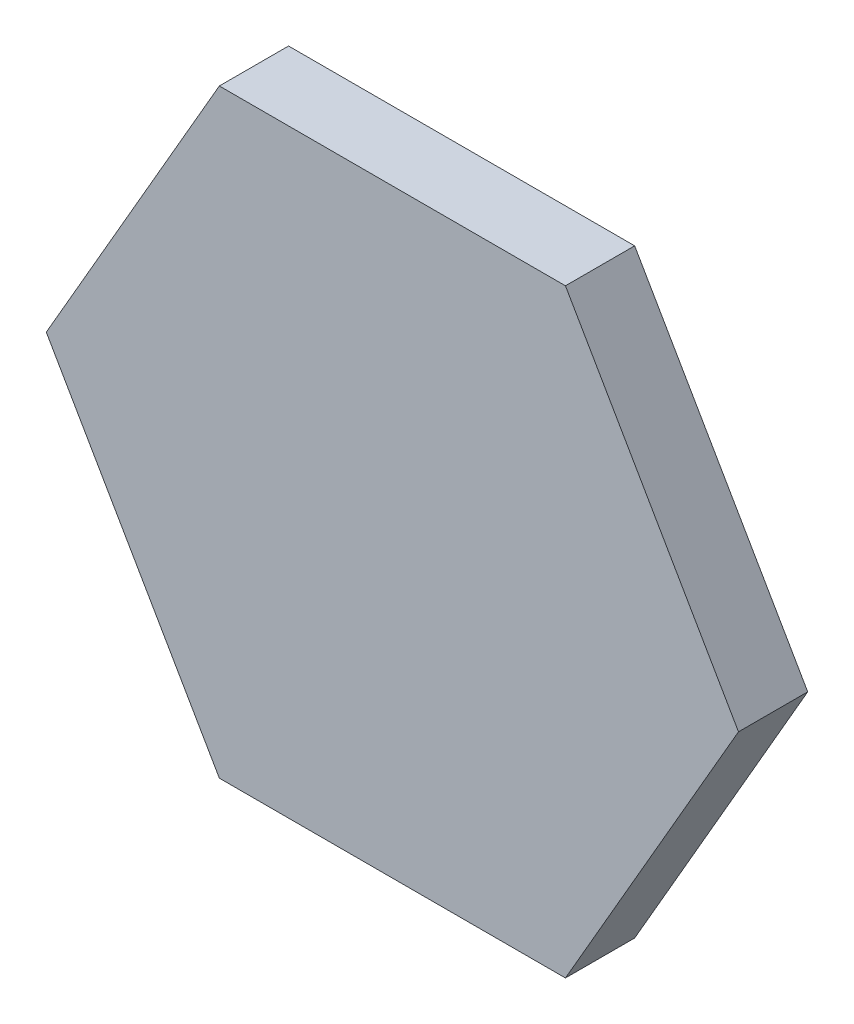
ISO-10303-21;
HEADER;
FILE_DESCRIPTION(('STEP AP214'),'2;1');
FILE_NAME('part.step','',(''),(''),'','','');
FILE_SCHEMA(('AUTOMOTIVE_DESIGN { 1 0 10303 214 1 1 1 1 }'));
ENDSEC;
DATA;
#1=APPLICATION_CONTEXT('core data for automotive mechanical design processes');
#2=APPLICATION_PROTOCOL_DEFINITION('international standard','automotive_design',2000,#1);
#3=PRODUCT_CONTEXT('',#1,'mechanical');
#4=PRODUCT('Part','Part','',(#3));
#5=PRODUCT_RELATED_PRODUCT_CATEGORY('part','',(#4));
#6=PRODUCT_DEFINITION_FORMATION('','',#4);
#7=PRODUCT_DEFINITION_CONTEXT('part definition',#1,'design');
#8=PRODUCT_DEFINITION('design','',#6,#7);
#9=PRODUCT_DEFINITION_SHAPE('','',#8);
#10=(LENGTH_UNIT() NAMED_UNIT(*) SI_UNIT(.MILLI.,.METRE.));
#11=(NAMED_UNIT(*) PLANE_ANGLE_UNIT() SI_UNIT($,.RADIAN.));
#12=(NAMED_UNIT(*) SI_UNIT($,.STERADIAN.) SOLID_ANGLE_UNIT());
#13=UNCERTAINTY_MEASURE_WITH_UNIT(LENGTH_MEASURE(1.E-05),#10,'distance_accuracy_value','');
#14=(GEOMETRIC_REPRESENTATION_CONTEXT(3) GLOBAL_UNCERTAINTY_ASSIGNED_CONTEXT((#13)) GLOBAL_UNIT_ASSIGNED_CONTEXT((#10,
#11,#12)) REPRESENTATION_CONTEXT('',''));
#15=CARTESIAN_POINT('',(0.,0.,0.));
#16=DIRECTION('',(0.,0.,1.));
#17=DIRECTION('',(1.,0.,0.));
#18=AXIS2_PLACEMENT_3D('',#15,#16,#17);
#19=CARTESIAN_POINT('',(-37.5,-64.9519052838329,15.));
#20=DIRECTION('',(0.,1.,0.));
#21=DIRECTION('',(0.,0.,1.));
#22=AXIS2_PLACEMENT_3D('',#19,#20,#21);
#23=PLANE('',#22);
#24=DIRECTION('',(1.,0.,0.));
#25=VECTOR('',#24,1.);
#26=CARTESIAN_POINT('',(-37.5,-64.9519052838329,0.));
#27=LINE('',#26,#25);
#28=CARTESIAN_POINT('',(-37.5,-64.9519052838329,0.));
#29=VERTEX_POINT('',#28);
#30=CARTESIAN_POINT('',(37.5,-64.9519052838329,0.));
#31=VERTEX_POINT('',#30);
#32=EDGE_CURVE('E116',#29,#31,#27,.T.);
#33=ORIENTED_EDGE('',*,*,#32,.T.);
#34=DIRECTION('',(0.,0.,-1.));
#35=VECTOR('',#34,1.);
#36=CARTESIAN_POINT('',(37.5,-64.9519052838329,15.));
#37=LINE('',#36,#35);
#38=CARTESIAN_POINT('',(37.5,-64.9519052838329,15.));
#39=VERTEX_POINT('',#38);
#40=EDGE_CURVE('E11',#39,#31,#37,.T.);
#41=ORIENTED_EDGE('',*,*,#40,.F.);
#42=DIRECTION('',(1.,0.,0.));
#43=VECTOR('',#42,1.);
#44=CARTESIAN_POINT('',(-37.5,-64.9519052838329,15.));
#45=LINE('',#44,#43);
#46=CARTESIAN_POINT('',(-37.5,-64.9519052838329,15.));
#47=VERTEX_POINT('',#46);
#48=EDGE_CURVE('E126',#47,#39,#45,.T.);
#49=ORIENTED_EDGE('',*,*,#48,.F.);
#50=DIRECTION('',(0.,0.,-1.));
#51=VECTOR('',#50,1.);
#52=CARTESIAN_POINT('',(-37.5,-64.9519052838329,15.));
#53=LINE('',#52,#51);
#54=EDGE_CURVE('E112',#47,#29,#53,.T.);
#55=ORIENTED_EDGE('',*,*,#54,.T.);
#56=EDGE_LOOP('',(#33,#41,#49,#55));
#57=FACE_BOUND('',#56,.T.);
#58=ADVANCED_FACE('F32',(#57),#23,.F.);
#59=CARTESIAN_POINT('',(37.5,-64.9519052838329,15.));
#60=DIRECTION('',(-0.866025403784439,0.5,0.));
#61=DIRECTION('',(-0.5,-0.866025403784439,0.));
#62=AXIS2_PLACEMENT_3D('',#59,#60,#61);
#63=PLANE('',#62);
#64=DIRECTION('',(0.5,0.866025403784439,0.));
#65=VECTOR('',#64,1.);
#66=CARTESIAN_POINT('',(37.5,-64.9519052838329,0.));
#67=LINE('',#66,#65);
#68=CARTESIAN_POINT('',(75.,0.,0.));
#69=VERTEX_POINT('',#68);
#70=EDGE_CURVE('E119',#31,#69,#67,.T.);
#71=ORIENTED_EDGE('',*,*,#70,.T.);
#72=DIRECTION('',(0.,0.,-1.));
#73=VECTOR('',#72,1.);
#74=CARTESIAN_POINT('',(75.,0.,15.));
#75=LINE('',#74,#73);
#76=CARTESIAN_POINT('',(75.,0.,15.));
#77=VERTEX_POINT('',#76);
#78=EDGE_CURVE('E40',#77,#69,#75,.T.);
#79=ORIENTED_EDGE('',*,*,#78,.F.);
#80=DIRECTION('',(0.5,0.866025403784439,0.));
#81=VECTOR('',#80,1.);
#82=CARTESIAN_POINT('',(37.5,-64.9519052838329,15.));
#83=LINE('',#82,#81);
#84=EDGE_CURVE('E85',#39,#77,#83,.T.);
#85=ORIENTED_EDGE('',*,*,#84,.F.);
#86=ORIENTED_EDGE('',*,*,#40,.T.);
#87=EDGE_LOOP('',(#71,#79,#85,#86));
#88=FACE_BOUND('',#87,.T.);
#89=ADVANCED_FACE('F150',(#88),#63,.F.);
#90=CARTESIAN_POINT('',(75.,0.,15.));
#91=DIRECTION('',(-0.866025403784439,-0.5,0.));
#92=DIRECTION('',(0.5,-0.866025403784439,0.));
#93=AXIS2_PLACEMENT_3D('',#90,#91,#92);
#94=PLANE('',#93);
#95=DIRECTION('',(-0.5,0.866025403784439,0.));
#96=VECTOR('',#95,1.);
#97=CARTESIAN_POINT('',(75.,0.,0.));
#98=LINE('',#97,#96);
#99=CARTESIAN_POINT('',(37.5,64.9519052838329,0.));
#100=VERTEX_POINT('',#99);
#101=EDGE_CURVE('E121',#69,#100,#98,.T.);
#102=ORIENTED_EDGE('',*,*,#101,.T.);
#103=DIRECTION('',(0.,0.,-1.));
#104=VECTOR('',#103,1.);
#105=CARTESIAN_POINT('',(37.5,64.9519052838329,15.));
#106=LINE('',#105,#104);
#107=CARTESIAN_POINT('',(37.5,64.9519052838329,15.));
#108=VERTEX_POINT('',#107);
#109=EDGE_CURVE('E107',#108,#100,#106,.T.);
#110=ORIENTED_EDGE('',*,*,#109,.F.);
#111=DIRECTION('',(-0.5,0.866025403784439,0.));
#112=VECTOR('',#111,1.);
#113=CARTESIAN_POINT('',(75.,0.,15.));
#114=LINE('',#113,#112);
#115=EDGE_CURVE('E98',#77,#108,#114,.T.);
#116=ORIENTED_EDGE('',*,*,#115,.F.);
#117=ORIENTED_EDGE('',*,*,#78,.T.);
#118=EDGE_LOOP('',(#102,#110,#116,#117));
#119=FACE_BOUND('',#118,.T.);
#120=ADVANCED_FACE('F132',(#119),#94,.F.);
#121=CARTESIAN_POINT('',(37.5,64.9519052838329,15.));
#122=DIRECTION('',(0.,-1.,0.));
#123=DIRECTION('',(0.,0.,-1.));
#124=AXIS2_PLACEMENT_3D('',#121,#122,#123);
#125=PLANE('',#124);
#126=DIRECTION('',(-1.,0.,0.));
#127=VECTOR('',#126,1.);
#128=CARTESIAN_POINT('',(37.5,64.9519052838329,0.));
#129=LINE('',#128,#127);
#130=CARTESIAN_POINT('',(-37.5,64.9519052838329,0.));
#131=VERTEX_POINT('',#130);
#132=EDGE_CURVE('E106',#100,#131,#129,.T.);
#133=ORIENTED_EDGE('',*,*,#132,.T.);
#134=DIRECTION('',(0.,0.,-1.));
#135=VECTOR('',#134,1.);
#136=CARTESIAN_POINT('',(-37.5,64.9519052838329,15.));
#137=LINE('',#136,#135);
#138=CARTESIAN_POINT('',(-37.5,64.9519052838329,15.));
#139=VERTEX_POINT('',#138);
#140=EDGE_CURVE('E103',#139,#131,#137,.T.);
#141=ORIENTED_EDGE('',*,*,#140,.F.);
#142=DIRECTION('',(-1.,0.,0.));
#143=VECTOR('',#142,1.);
#144=CARTESIAN_POINT('',(37.5,64.9519052838329,15.));
#145=LINE('',#144,#143);
#146=EDGE_CURVE('E92',#108,#139,#145,.T.);
#147=ORIENTED_EDGE('',*,*,#146,.F.);
#148=ORIENTED_EDGE('',*,*,#109,.T.);
#149=EDGE_LOOP('',(#133,#141,#147,#148));
#150=FACE_BOUND('',#149,.T.);
#151=ADVANCED_FACE('F104',(#150),#125,.F.);
#152=CARTESIAN_POINT('',(-37.5,64.9519052838329,15.));
#153=DIRECTION('',(0.866025403784439,-0.5,0.));
#154=DIRECTION('',(0.5,0.866025403784439,0.));
#155=AXIS2_PLACEMENT_3D('',#152,#153,#154);
#156=PLANE('',#155);
#157=DIRECTION('',(-0.5,-0.866025403784439,0.));
#158=VECTOR('',#157,1.);
#159=CARTESIAN_POINT('',(-37.5,64.9519052838329,0.));
#160=LINE('',#159,#158);
#161=CARTESIAN_POINT('',(-75.,0.,0.));
#162=VERTEX_POINT('',#161);
#163=EDGE_CURVE('E71',#131,#162,#160,.T.);
#164=ORIENTED_EDGE('',*,*,#163,.T.);
#165=DIRECTION('',(0.,0.,-1.));
#166=VECTOR('',#165,1.);
#167=CARTESIAN_POINT('',(-75.,0.,15.));
#168=LINE('',#167,#166);
#169=CARTESIAN_POINT('',(-75.,0.,15.));
#170=VERTEX_POINT('',#169);
#171=EDGE_CURVE('E108',#170,#162,#168,.T.);
#172=ORIENTED_EDGE('',*,*,#171,.F.);
#173=DIRECTION('',(-0.5,-0.866025403784439,0.));
#174=VECTOR('',#173,1.);
#175=CARTESIAN_POINT('',(-37.5,64.9519052838329,15.));
#176=LINE('',#175,#174);
#177=EDGE_CURVE('E96',#139,#170,#176,.T.);
#178=ORIENTED_EDGE('',*,*,#177,.F.);
#179=ORIENTED_EDGE('',*,*,#140,.T.);
#180=EDGE_LOOP('',(#164,#172,#178,#179));
#181=FACE_BOUND('',#180,.T.);
#182=ADVANCED_FACE('F110',(#181),#156,.F.);
#183=CARTESIAN_POINT('',(-75.,0.,15.));
#184=DIRECTION('',(0.866025403784439,0.5,0.));
#185=DIRECTION('',(-0.5,0.866025403784439,0.));
#186=AXIS2_PLACEMENT_3D('',#183,#184,#185);
#187=PLANE('',#186);
#188=DIRECTION('',(0.5,-0.866025403784439,0.));
#189=VECTOR('',#188,1.);
#190=CARTESIAN_POINT('',(-75.,0.,0.));
#191=LINE('',#190,#189);
#192=EDGE_CURVE('E77',#162,#29,#191,.T.);
#193=ORIENTED_EDGE('',*,*,#192,.T.);
#194=ORIENTED_EDGE('',*,*,#54,.F.);
#195=DIRECTION('',(0.5,-0.866025403784439,0.));
#196=VECTOR('',#195,1.);
#197=CARTESIAN_POINT('',(-75.,0.,15.));
#198=LINE('',#197,#196);
#199=EDGE_CURVE('E48',#170,#47,#198,.T.);
#200=ORIENTED_EDGE('',*,*,#199,.F.);
#201=ORIENTED_EDGE('',*,*,#171,.T.);
#202=EDGE_LOOP('',(#193,#194,#200,#201));
#203=FACE_BOUND('',#202,.T.);
#204=ADVANCED_FACE('F139',(#203),#187,.F.);
#205=CARTESIAN_POINT('',(0.,0.,15.));
#206=DIRECTION('',(0.,0.,1.));
#207=DIRECTION('',(1.,0.,0.));
#208=AXIS2_PLACEMENT_3D('',#205,#206,#207);
#209=PLANE('',#208);
#210=ORIENTED_EDGE('',*,*,#48,.T.);
#211=ORIENTED_EDGE('',*,*,#84,.T.);
#212=ORIENTED_EDGE('',*,*,#115,.T.);
#213=ORIENTED_EDGE('',*,*,#146,.T.);
#214=ORIENTED_EDGE('',*,*,#177,.T.);
#215=ORIENTED_EDGE('',*,*,#199,.T.);
#216=EDGE_LOOP('',(#210,#211,#212,#213,#214,#215));
#217=FACE_BOUND('',#216,.T.);
#218=ADVANCED_FACE('F94',(#217),#209,.T.);
#219=CARTESIAN_POINT('',(0.,0.,0.));
#220=DIRECTION('',(0.,0.,1.));
#221=DIRECTION('',(1.,0.,0.));
#222=AXIS2_PLACEMENT_3D('',#219,#220,#221);
#223=PLANE('',#222);
#224=ORIENTED_EDGE('',*,*,#32,.F.);
#225=ORIENTED_EDGE('',*,*,#192,.F.);
#226=ORIENTED_EDGE('',*,*,#163,.F.);
#227=ORIENTED_EDGE('',*,*,#132,.F.);
#228=ORIENTED_EDGE('',*,*,#101,.F.);
#229=ORIENTED_EDGE('',*,*,#70,.F.);
#230=EDGE_LOOP('',(#224,#225,#226,#227,#228,#229));
#231=FACE_BOUND('',#230,.T.);
#232=ADVANCED_FACE('F135',(#231),#223,.F.);
#233=CLOSED_SHELL('',(#58,#89,#120,#151,#182,#204,#218,#232));
#234=MANIFOLD_SOLID_BREP('B2',#233);
#235=ADVANCED_BREP_SHAPE_REPRESENTATION('',(#18,#234),#14);
#236=SHAPE_DEFINITION_REPRESENTATION(#9,#235);
ENDSEC;
END-ISO-10303-21;
